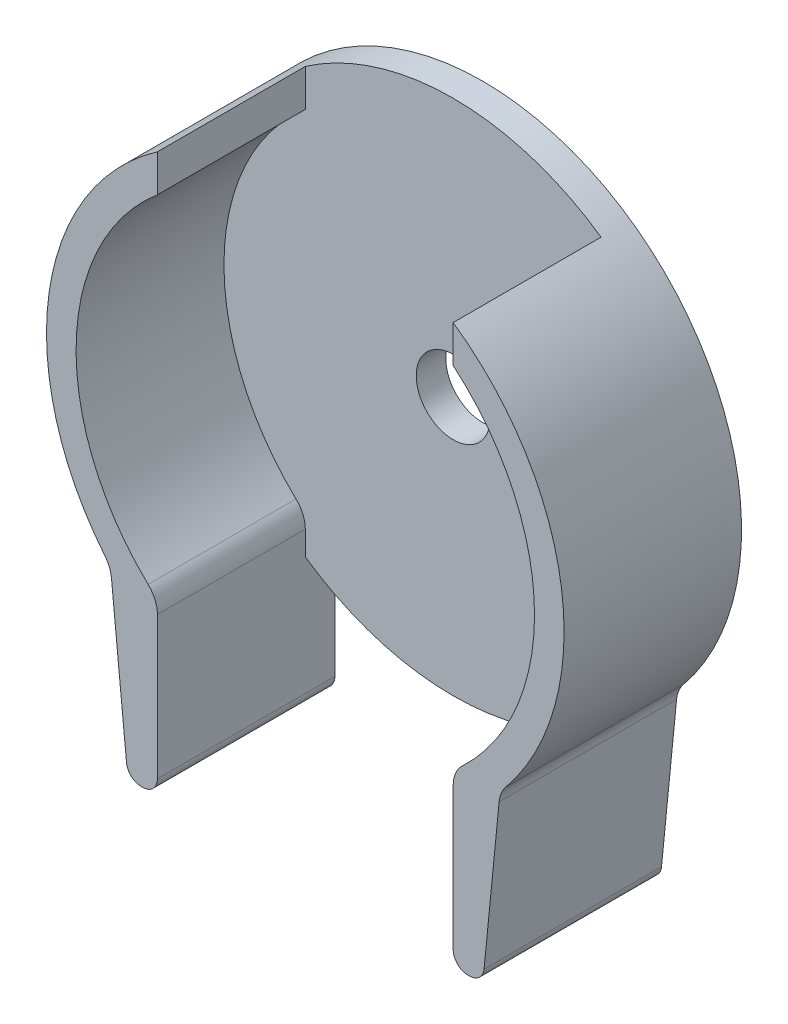
ISO-10303-21;
HEADER;
FILE_DESCRIPTION(('STEP AP214'),'2;1');
FILE_NAME('part.step','',(''),(''),'','','');
FILE_SCHEMA(('AUTOMOTIVE_DESIGN { 1 0 10303 214 1 1 1 1 }'));
ENDSEC;
DATA;
#1=APPLICATION_CONTEXT('core data for automotive mechanical design processes');
#2=APPLICATION_PROTOCOL_DEFINITION('international standard','automotive_design',2000,#1);
#3=PRODUCT_CONTEXT('',#1,'mechanical');
#4=PRODUCT('Part','Part','',(#3));
#5=PRODUCT_RELATED_PRODUCT_CATEGORY('part','',(#4));
#6=PRODUCT_DEFINITION_FORMATION('','',#4);
#7=PRODUCT_DEFINITION_CONTEXT('part definition',#1,'design');
#8=PRODUCT_DEFINITION('design','',#6,#7);
#9=PRODUCT_DEFINITION_SHAPE('','',#8);
#10=(LENGTH_UNIT() NAMED_UNIT(*) SI_UNIT(.MILLI.,.METRE.));
#11=(NAMED_UNIT(*) PLANE_ANGLE_UNIT() SI_UNIT($,.RADIAN.));
#12=(NAMED_UNIT(*) SI_UNIT($,.STERADIAN.) SOLID_ANGLE_UNIT());
#13=UNCERTAINTY_MEASURE_WITH_UNIT(LENGTH_MEASURE(1.E-05),#10,'distance_accuracy_value','');
#14=(GEOMETRIC_REPRESENTATION_CONTEXT(3) GLOBAL_UNCERTAINTY_ASSIGNED_CONTEXT((#13)) GLOBAL_UNIT_ASSIGNED_CONTEXT((#10,
#11,#12)) REPRESENTATION_CONTEXT('',''));
#15=CARTESIAN_POINT('',(0.,0.,0.));
#16=DIRECTION('',(0.,0.,1.));
#17=DIRECTION('',(1.,0.,0.));
#18=AXIS2_PLACEMENT_3D('',#15,#16,#17);
#19=CARTESIAN_POINT('',(0.,0.,12.));
#20=DIRECTION('',(0.,0.,-1.));
#21=DIRECTION('',(-1.,0.,0.));
#22=AXIS2_PLACEMENT_3D('',#19,#20,#21);
#23=CYLINDRICAL_SURFACE('',#22,17.5);
#24=CARTESIAN_POINT('',(0.,0.,2.));
#25=DIRECTION('',(0.,0.,-1.));
#26=DIRECTION('',(-1.,0.,0.));
#27=AXIS2_PLACEMENT_3D('',#24,#25,#26);
#28=CIRCLE('',#27,17.5);
#29=CARTESIAN_POINT('',(10.,-14.3614066163451,2.));
#30=VERTEX_POINT('',#29);
#31=CARTESIAN_POINT('',(-10.,-14.3614066163451,2.));
#32=VERTEX_POINT('',#31);
#33=EDGE_CURVE('E210',#30,#32,#28,.T.);
#34=ORIENTED_EDGE('',*,*,#33,.T.);
#35=DIRECTION('',(0.,0.,1.));
#36=VECTOR('',#35,1.);
#37=CARTESIAN_POINT('',(-10.,-14.3614066163451,0.));
#38=LINE('',#37,#36);
#39=CARTESIAN_POINT('',(-10.,-14.3614066163451,0.));
#40=VERTEX_POINT('',#39);
#41=EDGE_CURVE('E193',#40,#32,#38,.T.);
#42=ORIENTED_EDGE('',*,*,#41,.F.);
#43=CARTESIAN_POINT('',(0.,0.,0.));
#44=DIRECTION('',(0.,0.,1.));
#45=DIRECTION('',(1.,0.,0.));
#46=AXIS2_PLACEMENT_3D('',#43,#44,#45);
#47=CIRCLE('',#46,17.5);
#48=CARTESIAN_POINT('',(10.,-14.3614066163451,0.));
#49=VERTEX_POINT('',#48);
#50=EDGE_CURVE('E205',#40,#49,#47,.T.);
#51=ORIENTED_EDGE('',*,*,#50,.T.);
#52=DIRECTION('',(0.,0.,1.));
#53=VECTOR('',#52,1.);
#54=CARTESIAN_POINT('',(10.,-14.3614066163451,0.));
#55=LINE('',#54,#53);
#56=EDGE_CURVE('E322',#49,#30,#55,.T.);
#57=ORIENTED_EDGE('',*,*,#56,.T.);
#58=EDGE_LOOP('',(#34,#42,#51,#57));
#59=FACE_BOUND('',#58,.T.);
#60=ADVANCED_FACE('F45',(#59),#23,.T.);
#61=CARTESIAN_POINT('',(0.,0.,12.));
#62=DIRECTION('',(0.,0.,1.));
#63=DIRECTION('',(1.,0.,0.));
#64=AXIS2_PLACEMENT_3D('',#61,#62,#63);
#65=PLANE('',#64);
#66=DIRECTION('',(1.,0.,0.));
#67=VECTOR('',#66,1.);
#68=CARTESIAN_POINT('',(-10.,-23.3578165503246,12.));
#69=LINE('',#68,#67);
#70=CARTESIAN_POINT('',(-11.0939448005069,-23.3578165503246,12.));
#71=VERTEX_POINT('',#70);
#72=CARTESIAN_POINT('',(-11.,-23.3578165503246,12.));
#73=VERTEX_POINT('',#72);
#74=EDGE_CURVE('E299',#71,#73,#69,.T.);
#75=ORIENTED_EDGE('',*,*,#74,.T.);
#76=CARTESIAN_POINT('',(-11.,-22.3578165503246,12.));
#77=DIRECTION('',(0.,0.,1.));
#78=DIRECTION('',(1.,0.,0.));
#79=AXIS2_PLACEMENT_3D('',#76,#77,#78);
#80=CIRCLE('',#79,1.);
#81=CARTESIAN_POINT('',(-10.,-22.3578165503246,12.));
#82=VERTEX_POINT('',#81);
#83=EDGE_CURVE('E61',#73,#82,#80,.T.);
#84=ORIENTED_EDGE('',*,*,#83,.T.);
#85=DIRECTION('',(0.,-1.,0.));
#86=VECTOR('',#85,1.);
#87=CARTESIAN_POINT('',(-10.,0.,12.));
#88=LINE('',#87,#86);
#89=CARTESIAN_POINT('',(-10.,-12.737739202857,12.));
#90=VERTEX_POINT('',#89);
#91=EDGE_CURVE('E352',#90,#82,#88,.T.);
#92=ORIENTED_EDGE('',*,*,#91,.F.);
#93=CARTESIAN_POINT('',(-12.,-12.737739202857,12.));
#94=DIRECTION('',(0.,0.,1.));
#95=DIRECTION('',(1.,0.,0.));
#96=AXIS2_PLACEMENT_3D('',#93,#94,#95);
#97=CIRCLE('',#96,2.);
#98=CARTESIAN_POINT('',(-10.6285714285714,-11.2819975796733,12.));
#99=VERTEX_POINT('',#98);
#100=EDGE_CURVE('E241',#90,#99,#97,.T.);
#101=ORIENTED_EDGE('',*,*,#100,.T.);
#102=CARTESIAN_POINT('',(0.,0.,12.));
#103=DIRECTION('',(0.,0.,1.));
#104=DIRECTION('',(1.,0.,0.));
#105=AXIS2_PLACEMENT_3D('',#102,#103,#104);
#106=CIRCLE('',#105,15.5);
#107=CARTESIAN_POINT('',(-10.,11.842719282327,12.));
#108=VERTEX_POINT('',#107);
#109=EDGE_CURVE('E222',#108,#99,#106,.T.);
#110=ORIENTED_EDGE('',*,*,#109,.F.);
#111=CARTESIAN_POINT('',(-10.,14.3614066163451,12.));
#112=VERTEX_POINT('',#111);
#113=EDGE_CURVE('E355',#112,#108,#88,.T.);
#114=ORIENTED_EDGE('',*,*,#113,.F.);
#115=CARTESIAN_POINT('',(0.,0.,12.));
#116=DIRECTION('',(0.,0.,1.));
#117=DIRECTION('',(1.,0.,0.));
#118=AXIS2_PLACEMENT_3D('',#115,#116,#117);
#119=CIRCLE('',#118,17.5);
#120=CARTESIAN_POINT('',(-13.549863591173,-11.0748000731663,12.));
#121=VERTEX_POINT('',#120);
#122=EDGE_CURVE('E216',#112,#121,#119,.T.);
#123=ORIENTED_EDGE('',*,*,#122,.T.);
#124=CARTESIAN_POINT('',(-15.0984194301642,-12.3404915100996,12.));
#125=DIRECTION('',(0.,0.,1.));
#126=DIRECTION('',(1.,0.,0.));
#127=AXIS2_PLACEMENT_3D('',#124,#125,#126);
#128=CIRCLE('',#127,2.);
#129=CARTESIAN_POINT('',(-13.1081129344097,-12.1438190591629,12.));
#130=VERTEX_POINT('',#129);
#131=EDGE_CURVE('E261',#121,#130,#128,.F.);
#132=ORIENTED_EDGE('',*,*,#131,.T.);
#133=DIRECTION('',(0.0983362254683656,-0.995153247877248,0.));
#134=VECTOR('',#133,1.);
#135=CARTESIAN_POINT('',(-12.,-23.3578165503246,12.));
#136=LINE('',#135,#134);
#137=CARTESIAN_POINT('',(-12.0890980483841,-22.456152775793,12.));
#138=VERTEX_POINT('',#137);
#139=EDGE_CURVE('E301',#130,#138,#136,.T.);
#140=ORIENTED_EDGE('',*,*,#139,.T.);
#141=CARTESIAN_POINT('',(-11.0939448005069,-22.3578165503246,12.));
#142=DIRECTION('',(0.,0.,1.));
#143=DIRECTION('',(1.,0.,0.));
#144=AXIS2_PLACEMENT_3D('',#141,#142,#143);
#145=CIRCLE('',#144,1.);
#146=EDGE_CURVE('E60',#138,#71,#145,.T.);
#147=ORIENTED_EDGE('',*,*,#146,.T.);
#148=EDGE_LOOP('',(#75,#84,#92,#101,#110,#114,#123,#132,#140,#147));
#149=FACE_BOUND('',#148,.T.);
#150=ADVANCED_FACE('F296',(#149),#65,.T.);
#151=CARTESIAN_POINT('',(0.,0.,12.));
#152=DIRECTION('',(0.,0.,-1.));
#153=DIRECTION('',(-1.,0.,0.));
#154=AXIS2_PLACEMENT_3D('',#151,#152,#153);
#155=CYLINDRICAL_SURFACE('',#154,15.5);
#156=ORIENTED_EDGE('',*,*,#109,.T.);
#157=DIRECTION('',(0.,0.,-1.));
#158=VECTOR('',#157,1.);
#159=CARTESIAN_POINT('',(-10.6285714285714,-11.2819975796733,12.));
#160=LINE('',#159,#158);
#161=CARTESIAN_POINT('',(-10.6285714285714,-11.2819975796733,2.));
#162=VERTEX_POINT('',#161);
#163=EDGE_CURVE('E243',#99,#162,#160,.T.);
#164=ORIENTED_EDGE('',*,*,#163,.T.);
#165=CARTESIAN_POINT('',(0.,0.,2.));
#166=DIRECTION('',(0.,0.,1.));
#167=DIRECTION('',(1.,0.,0.));
#168=AXIS2_PLACEMENT_3D('',#165,#166,#167);
#169=CIRCLE('',#168,15.5);
#170=CARTESIAN_POINT('',(-10.,11.842719282327,2.));
#171=VERTEX_POINT('',#170);
#172=EDGE_CURVE('E365',#171,#162,#169,.T.);
#173=ORIENTED_EDGE('',*,*,#172,.F.);
#174=DIRECTION('',(0.,0.,-1.));
#175=VECTOR('',#174,1.);
#176=CARTESIAN_POINT('',(-10.,11.842719282327,12.));
#177=LINE('',#176,#175);
#178=EDGE_CURVE('E353',#108,#171,#177,.T.);
#179=ORIENTED_EDGE('',*,*,#178,.F.);
#180=EDGE_LOOP('',(#156,#164,#173,#179));
#181=FACE_BOUND('',#180,.T.);
#182=ADVANCED_FACE('F381',(#181),#155,.F.);
#183=CARTESIAN_POINT('',(13.549863591173,-11.0748000731663,12.));
#184=VERTEX_POINT('',#183);
#185=CARTESIAN_POINT('',(10.,14.3614066163451,12.));
#186=VERTEX_POINT('',#185);
#187=EDGE_CURVE('E217',#184,#186,#119,.T.);
#188=ORIENTED_EDGE('',*,*,#187,.F.);
#189=DIRECTION('',(0.,0.,-1.));
#190=VECTOR('',#189,1.);
#191=CARTESIAN_POINT('',(13.549863591173,-11.0748000731663,12.));
#192=LINE('',#191,#190);
#193=CARTESIAN_POINT('',(13.549863591173,-11.0748000731663,0.));
#194=VERTEX_POINT('',#193);
#195=EDGE_CURVE('E253',#184,#194,#192,.T.);
#196=ORIENTED_EDGE('',*,*,#195,.T.);
#197=CARTESIAN_POINT('',(-13.549863591173,-11.0748000731663,0.));
#198=VERTEX_POINT('',#197);
#199=EDGE_CURVE('E219',#194,#198,#47,.T.);
#200=ORIENTED_EDGE('',*,*,#199,.T.);
#201=DIRECTION('',(0.,0.,-1.));
#202=VECTOR('',#201,1.);
#203=CARTESIAN_POINT('',(-13.549863591173,-11.0748000731664,12.));
#204=LINE('',#203,#202);
#205=EDGE_CURVE('E255',#198,#121,#204,.F.);
#206=ORIENTED_EDGE('',*,*,#205,.T.);
#207=ORIENTED_EDGE('',*,*,#122,.F.);
#208=DIRECTION('',(0.,0.,-1.));
#209=VECTOR('',#208,1.);
#210=CARTESIAN_POINT('',(-10.,14.3614066163451,12.));
#211=LINE('',#210,#209);
#212=CARTESIAN_POINT('',(-10.,14.3614066163451,2.));
#213=VERTEX_POINT('',#212);
#214=EDGE_CURVE('E230',#112,#213,#211,.T.);
#215=ORIENTED_EDGE('',*,*,#214,.T.);
#216=CARTESIAN_POINT('',(10.,14.3614066163451,2.));
#217=VERTEX_POINT('',#216);
#218=EDGE_CURVE('E338',#213,#217,#28,.T.);
#219=ORIENTED_EDGE('',*,*,#218,.T.);
#220=DIRECTION('',(0.,0.,-1.));
#221=VECTOR('',#220,1.);
#222=CARTESIAN_POINT('',(10.,14.3614066163451,12.));
#223=LINE('',#222,#221);
#224=EDGE_CURVE('E350',#217,#186,#223,.F.);
#225=ORIENTED_EDGE('',*,*,#224,.T.);
#226=EDGE_LOOP('',(#188,#196,#200,#206,#207,#215,#219,#225));
#227=FACE_BOUND('',#226,.T.);
#228=ADVANCED_FACE('F392',(#227),#23,.T.);
#229=DIRECTION('',(0.,1.,0.));
#230=VECTOR('',#229,1.);
#231=CARTESIAN_POINT('',(10.,0.,12.));
#232=LINE('',#231,#230);
#233=CARTESIAN_POINT('',(10.,-22.3578165503246,12.));
#234=VERTEX_POINT('',#233);
#235=CARTESIAN_POINT('',(10.,-12.737739202857,12.));
#236=VERTEX_POINT('',#235);
#237=EDGE_CURVE('E346',#234,#236,#232,.T.);
#238=ORIENTED_EDGE('',*,*,#237,.F.);
#239=CARTESIAN_POINT('',(11.,-22.3578165503246,12.));
#240=DIRECTION('',(0.,0.,1.));
#241=DIRECTION('',(1.,0.,0.));
#242=AXIS2_PLACEMENT_3D('',#239,#240,#241);
#243=CIRCLE('',#242,1.);
#244=CARTESIAN_POINT('',(11.,-23.3578165503246,12.));
#245=VERTEX_POINT('',#244);
#246=EDGE_CURVE('E271',#234,#245,#243,.T.);
#247=ORIENTED_EDGE('',*,*,#246,.T.);
#248=DIRECTION('',(1.,0.,0.));
#249=VECTOR('',#248,1.);
#250=CARTESIAN_POINT('',(10.,-23.3578165503246,12.));
#251=LINE('',#250,#249);
#252=CARTESIAN_POINT('',(11.0939448005069,-23.3578165503246,12.));
#253=VERTEX_POINT('',#252);
#254=EDGE_CURVE('E316',#245,#253,#251,.T.);
#255=ORIENTED_EDGE('',*,*,#254,.T.);
#256=CARTESIAN_POINT('',(11.0939448005069,-22.3578165503246,12.));
#257=DIRECTION('',(0.,0.,1.));
#258=DIRECTION('',(1.,0.,0.));
#259=AXIS2_PLACEMENT_3D('',#256,#257,#258);
#260=CIRCLE('',#259,1.);
#261=CARTESIAN_POINT('',(12.0890980483841,-22.456152775793,12.));
#262=VERTEX_POINT('',#261);
#263=EDGE_CURVE('E272',#253,#262,#260,.T.);
#264=ORIENTED_EDGE('',*,*,#263,.T.);
#265=DIRECTION('',(0.0983362254683651,0.995153247877248,0.));
#266=VECTOR('',#265,1.);
#267=CARTESIAN_POINT('',(12.,-23.3578165503246,12.));
#268=LINE('',#267,#266);
#269=CARTESIAN_POINT('',(13.1081129344097,-12.1438190591629,12.));
#270=VERTEX_POINT('',#269);
#271=EDGE_CURVE('E321',#262,#270,#268,.T.);
#272=ORIENTED_EDGE('',*,*,#271,.T.);
#273=CARTESIAN_POINT('',(15.0984194301642,-12.3404915100996,12.));
#274=DIRECTION('',(0.,0.,1.));
#275=DIRECTION('',(1.,0.,0.));
#276=AXIS2_PLACEMENT_3D('',#273,#274,#275);
#277=CIRCLE('',#276,2.);
#278=EDGE_CURVE('E256',#270,#184,#277,.F.);
#279=ORIENTED_EDGE('',*,*,#278,.T.);
#280=ORIENTED_EDGE('',*,*,#187,.T.);
#281=CARTESIAN_POINT('',(10.,11.842719282327,12.));
#282=VERTEX_POINT('',#281);
#283=EDGE_CURVE('E343',#282,#186,#232,.T.);
#284=ORIENTED_EDGE('',*,*,#283,.F.);
#285=CARTESIAN_POINT('',(10.6285714285714,-11.2819975796733,12.));
#286=VERTEX_POINT('',#285);
#287=EDGE_CURVE('E361',#286,#282,#106,.T.);
#288=ORIENTED_EDGE('',*,*,#287,.F.);
#289=CARTESIAN_POINT('',(12.,-12.737739202857,12.));
#290=DIRECTION('',(0.,0.,1.));
#291=DIRECTION('',(1.,0.,0.));
#292=AXIS2_PLACEMENT_3D('',#289,#290,#291);
#293=CIRCLE('',#292,2.);
#294=EDGE_CURVE('E232',#286,#236,#293,.T.);
#295=ORIENTED_EDGE('',*,*,#294,.T.);
#296=EDGE_LOOP('',(#238,#247,#255,#264,#272,#279,#280,#284,#288,#295));
#297=FACE_BOUND('',#296,.T.);
#298=ADVANCED_FACE('F417',(#297),#65,.T.);
#299=CARTESIAN_POINT('',(0.,0.,0.));
#300=DIRECTION('',(0.,0.,1.));
#301=DIRECTION('',(1.,0.,0.));
#302=AXIS2_PLACEMENT_3D('',#299,#300,#301);
#303=PLANE('',#302);
#304=CARTESIAN_POINT('',(0.,0.,0.));
#305=DIRECTION('',(0.,0.,1.));
#306=DIRECTION('',(1.,0.,0.));
#307=AXIS2_PLACEMENT_3D('',#304,#305,#306);
#308=CIRCLE('',#307,2.5);
#309=CARTESIAN_POINT('',(2.5,0.,0.));
#310=VERTEX_POINT('',#309);
#311=EDGE_CURVE('E226',#310,#310,#308,.F.);
#312=ORIENTED_EDGE('',*,*,#311,.F.);
#313=EDGE_LOOP('',(#312));
#314=FACE_BOUND('',#313,.T.);
#315=DIRECTION('',(1.,0.,0.));
#316=VECTOR('',#315,1.);
#317=CARTESIAN_POINT('',(10.,-23.3578165503246,0.));
#318=LINE('',#317,#316);
#319=CARTESIAN_POINT('',(11.,-23.3578165503246,0.));
#320=VERTEX_POINT('',#319);
#321=CARTESIAN_POINT('',(11.0939448005069,-23.3578165503246,0.));
#322=VERTEX_POINT('',#321);
#323=EDGE_CURVE('E326',#320,#322,#318,.T.);
#324=ORIENTED_EDGE('',*,*,#323,.F.);
#325=CARTESIAN_POINT('',(11.,-22.3578165503246,0.));
#326=DIRECTION('',(0.,0.,1.));
#327=DIRECTION('',(1.,0.,0.));
#328=AXIS2_PLACEMENT_3D('',#325,#326,#327);
#329=CIRCLE('',#328,1.);
#330=CARTESIAN_POINT('',(10.,-22.3578165503246,0.));
#331=VERTEX_POINT('',#330);
#332=EDGE_CURVE('E286',#320,#331,#329,.F.);
#333=ORIENTED_EDGE('',*,*,#332,.T.);
#334=DIRECTION('',(0.,-1.,0.));
#335=VECTOR('',#334,1.);
#336=CARTESIAN_POINT('',(10.,-14.3614066163451,0.));
#337=LINE('',#336,#335);
#338=EDGE_CURVE('E213',#49,#331,#337,.T.);
#339=ORIENTED_EDGE('',*,*,#338,.F.);
#340=ORIENTED_EDGE('',*,*,#50,.F.);
#341=DIRECTION('',(0.,1.,0.));
#342=VECTOR('',#341,1.);
#343=CARTESIAN_POINT('',(-10.,-14.3614066163451,0.));
#344=LINE('',#343,#342);
#345=CARTESIAN_POINT('',(-10.,-22.3578165503246,0.));
#346=VERTEX_POINT('',#345);
#347=EDGE_CURVE('E192',#346,#40,#344,.T.);
#348=ORIENTED_EDGE('',*,*,#347,.F.);
#349=CARTESIAN_POINT('',(-11.,-22.3578165503246,0.));
#350=DIRECTION('',(0.,0.,1.));
#351=DIRECTION('',(1.,0.,0.));
#352=AXIS2_PLACEMENT_3D('',#349,#350,#351);
#353=CIRCLE('',#352,1.);
#354=CARTESIAN_POINT('',(-11.,-23.3578165503246,0.));
#355=VERTEX_POINT('',#354);
#356=EDGE_CURVE('E284',#346,#355,#353,.F.);
#357=ORIENTED_EDGE('',*,*,#356,.T.);
#358=DIRECTION('',(1.,0.,0.));
#359=VECTOR('',#358,1.);
#360=CARTESIAN_POINT('',(-10.,-23.3578165503246,0.));
#361=LINE('',#360,#359);
#362=CARTESIAN_POINT('',(-11.0939448005069,-23.3578165503246,0.));
#363=VERTEX_POINT('',#362);
#364=EDGE_CURVE('E201',#363,#355,#361,.T.);
#365=ORIENTED_EDGE('',*,*,#364,.F.);
#366=CARTESIAN_POINT('',(-11.0939448005069,-22.3578165503246,0.));
#367=DIRECTION('',(0.,0.,1.));
#368=DIRECTION('',(1.,0.,0.));
#369=AXIS2_PLACEMENT_3D('',#366,#367,#368);
#370=CIRCLE('',#369,1.);
#371=CARTESIAN_POINT('',(-12.0890980483841,-22.456152775793,0.));
#372=VERTEX_POINT('',#371);
#373=EDGE_CURVE('E278',#363,#372,#370,.F.);
#374=ORIENTED_EDGE('',*,*,#373,.T.);
#375=DIRECTION('',(0.0983362254683656,-0.995153247877248,0.));
#376=VECTOR('',#375,1.);
#377=CARTESIAN_POINT('',(-12.,-23.3578165503246,0.));
#378=LINE('',#377,#376);
#379=CARTESIAN_POINT('',(-13.1081129344097,-12.1438190591629,0.));
#380=VERTEX_POINT('',#379);
#381=EDGE_CURVE('E310',#380,#372,#378,.T.);
#382=ORIENTED_EDGE('',*,*,#381,.F.);
#383=CARTESIAN_POINT('',(-15.0984194301642,-12.3404915100996,0.));
#384=DIRECTION('',(0.,0.,1.));
#385=DIRECTION('',(1.,0.,0.));
#386=AXIS2_PLACEMENT_3D('',#383,#384,#385);
#387=CIRCLE('',#386,2.);
#388=EDGE_CURVE('E266',#380,#198,#387,.T.);
#389=ORIENTED_EDGE('',*,*,#388,.T.);
#390=ORIENTED_EDGE('',*,*,#199,.F.);
#391=CARTESIAN_POINT('',(15.0984194301642,-12.3404915100996,0.));
#392=DIRECTION('',(0.,0.,1.));
#393=DIRECTION('',(1.,0.,0.));
#394=AXIS2_PLACEMENT_3D('',#391,#392,#393);
#395=CIRCLE('',#394,2.);
#396=CARTESIAN_POINT('',(13.1081129344097,-12.1438190591629,0.));
#397=VERTEX_POINT('',#396);
#398=EDGE_CURVE('E262',#194,#397,#395,.T.);
#399=ORIENTED_EDGE('',*,*,#398,.T.);
#400=DIRECTION('',(0.0983362254683651,0.995153247877248,0.));
#401=VECTOR('',#400,1.);
#402=CARTESIAN_POINT('',(12.,-23.3578165503246,0.));
#403=LINE('',#402,#401);
#404=CARTESIAN_POINT('',(12.0890980483841,-22.456152775793,0.));
#405=VERTEX_POINT('',#404);
#406=EDGE_CURVE('E324',#405,#397,#403,.T.);
#407=ORIENTED_EDGE('',*,*,#406,.F.);
#408=CARTESIAN_POINT('',(11.0939448005069,-22.3578165503246,0.));
#409=DIRECTION('',(0.,0.,1.));
#410=DIRECTION('',(1.,0.,0.));
#411=AXIS2_PLACEMENT_3D('',#408,#409,#410);
#412=CIRCLE('',#411,1.);
#413=EDGE_CURVE('E281',#405,#322,#412,.F.);
#414=ORIENTED_EDGE('',*,*,#413,.T.);
#415=EDGE_LOOP('',(#324,#333,#339,#340,#348,#357,#365,#374,#382,#389,#390,#399,#407,#414));
#416=FACE_BOUND('',#415,.T.);
#417=ADVANCED_FACE('F214',(#314,#416),#303,.F.);
#418=CARTESIAN_POINT('',(10.6285714285714,-11.2819975796733,2.));
#419=VERTEX_POINT('',#418);
#420=CARTESIAN_POINT('',(10.,11.842719282327,2.));
#421=VERTEX_POINT('',#420);
#422=EDGE_CURVE('E363',#419,#421,#169,.T.);
#423=ORIENTED_EDGE('',*,*,#422,.F.);
#424=DIRECTION('',(0.,0.,-1.));
#425=VECTOR('',#424,1.);
#426=CARTESIAN_POINT('',(10.6285714285714,-11.2819975796733,12.));
#427=LINE('',#426,#425);
#428=EDGE_CURVE('E231',#419,#286,#427,.F.);
#429=ORIENTED_EDGE('',*,*,#428,.T.);
#430=ORIENTED_EDGE('',*,*,#287,.T.);
#431=DIRECTION('',(0.,0.,-1.));
#432=VECTOR('',#431,1.);
#433=CARTESIAN_POINT('',(10.,11.842719282327,12.));
#434=LINE('',#433,#432);
#435=EDGE_CURVE('E345',#421,#282,#434,.F.);
#436=ORIENTED_EDGE('',*,*,#435,.F.);
#437=EDGE_LOOP('',(#423,#429,#430,#436));
#438=FACE_BOUND('',#437,.T.);
#439=ADVANCED_FACE('F427',(#438),#155,.F.);
#440=CARTESIAN_POINT('',(0.,0.,2.));
#441=DIRECTION('',(0.,0.,1.));
#442=DIRECTION('',(1.,0.,0.));
#443=AXIS2_PLACEMENT_3D('',#440,#441,#442);
#444=PLANE('',#443);
#445=DIRECTION('',(0.,1.,0.));
#446=VECTOR('',#445,1.);
#447=CARTESIAN_POINT('',(10.,-17.5,2.));
#448=LINE('',#447,#446);
#449=CARTESIAN_POINT('',(10.,-12.737739202857,2.));
#450=VERTEX_POINT('',#449);
#451=EDGE_CURVE('E340',#30,#450,#448,.T.);
#452=ORIENTED_EDGE('',*,*,#451,.T.);
#453=CARTESIAN_POINT('',(12.,-12.737739202857,2.));
#454=DIRECTION('',(0.,0.,1.));
#455=DIRECTION('',(1.,0.,0.));
#456=AXIS2_PLACEMENT_3D('',#453,#454,#455);
#457=CIRCLE('',#456,2.);
#458=EDGE_CURVE('E244',#450,#419,#457,.F.);
#459=ORIENTED_EDGE('',*,*,#458,.T.);
#460=ORIENTED_EDGE('',*,*,#422,.T.);
#461=EDGE_CURVE('E209',#421,#217,#448,.T.);
#462=ORIENTED_EDGE('',*,*,#461,.T.);
#463=ORIENTED_EDGE('',*,*,#218,.F.);
#464=DIRECTION('',(0.,1.,0.));
#465=VECTOR('',#464,1.);
#466=CARTESIAN_POINT('',(-10.,-17.5,2.));
#467=LINE('',#466,#465);
#468=EDGE_CURVE('E334',#171,#213,#467,.T.);
#469=ORIENTED_EDGE('',*,*,#468,.F.);
#470=ORIENTED_EDGE('',*,*,#172,.T.);
#471=CARTESIAN_POINT('',(-12.,-12.737739202857,2.));
#472=DIRECTION('',(0.,0.,1.));
#473=DIRECTION('',(1.,0.,0.));
#474=AXIS2_PLACEMENT_3D('',#471,#472,#473);
#475=CIRCLE('',#474,2.);
#476=CARTESIAN_POINT('',(-10.,-12.737739202857,2.));
#477=VERTEX_POINT('',#476);
#478=EDGE_CURVE('E250',#162,#477,#475,.F.);
#479=ORIENTED_EDGE('',*,*,#478,.T.);
#480=EDGE_CURVE('E337',#32,#477,#467,.T.);
#481=ORIENTED_EDGE('',*,*,#480,.F.);
#482=ORIENTED_EDGE('',*,*,#33,.F.);
#483=EDGE_LOOP('',(#452,#459,#460,#462,#463,#469,#470,#479,#481,#482));
#484=FACE_BOUND('',#483,.T.);
#485=CARTESIAN_POINT('',(0.,0.,2.));
#486=DIRECTION('',(0.,0.,1.));
#487=DIRECTION('',(1.,0.,0.));
#488=AXIS2_PLACEMENT_3D('',#485,#486,#487);
#489=CIRCLE('',#488,2.5);
#490=CARTESIAN_POINT('',(2.5,0.,2.));
#491=VERTEX_POINT('',#490);
#492=EDGE_CURVE('E225',#491,#491,#489,.F.);
#493=ORIENTED_EDGE('',*,*,#492,.T.);
#494=EDGE_LOOP('',(#493));
#495=FACE_BOUND('',#494,.T.);
#496=ADVANCED_FACE('F372',(#484,#495),#444,.T.);
#497=CARTESIAN_POINT('',(0.,0.,12.));
#498=DIRECTION('',(0.,0.,-1.));
#499=DIRECTION('',(-1.,0.,0.));
#500=AXIS2_PLACEMENT_3D('',#497,#498,#499);
#501=CYLINDRICAL_SURFACE('',#500,2.5);
#502=ORIENTED_EDGE('',*,*,#492,.F.);
#503=EDGE_LOOP('',(#502));
#504=FACE_BOUND('',#503,.T.);
#505=ORIENTED_EDGE('',*,*,#311,.T.);
#506=EDGE_LOOP('',(#505));
#507=FACE_BOUND('',#506,.T.);
#508=ADVANCED_FACE('F438',(#504,#507),#501,.F.);
#509=CARTESIAN_POINT('',(10.,-17.5,2.));
#510=DIRECTION('',(1.,0.,0.));
#511=DIRECTION('',(0.,0.,-1.));
#512=AXIS2_PLACEMENT_3D('',#509,#510,#511);
#513=PLANE('',#512);
#514=ORIENTED_EDGE('',*,*,#461,.F.);
#515=ORIENTED_EDGE('',*,*,#435,.T.);
#516=ORIENTED_EDGE('',*,*,#283,.T.);
#517=ORIENTED_EDGE('',*,*,#224,.F.);
#518=EDGE_LOOP('',(#514,#515,#516,#517));
#519=FACE_BOUND('',#518,.T.);
#520=ADVANCED_FACE('F436',(#519),#513,.F.);
#521=CARTESIAN_POINT('',(-10.,-17.5,2.));
#522=DIRECTION('',(-1.,0.,0.));
#523=DIRECTION('',(0.,0.,1.));
#524=AXIS2_PLACEMENT_3D('',#521,#522,#523);
#525=PLANE('',#524);
#526=ORIENTED_EDGE('',*,*,#113,.T.);
#527=ORIENTED_EDGE('',*,*,#178,.T.);
#528=ORIENTED_EDGE('',*,*,#468,.T.);
#529=ORIENTED_EDGE('',*,*,#214,.F.);
#530=EDGE_LOOP('',(#526,#527,#528,#529));
#531=FACE_BOUND('',#530,.T.);
#532=ADVANCED_FACE('F387',(#531),#525,.F.);
#533=ORIENTED_EDGE('',*,*,#91,.T.);
#534=DIRECTION('',(0.,0.,1.));
#535=VECTOR('',#534,1.);
#536=CARTESIAN_POINT('',(-10.,-22.3578165503246,0.));
#537=LINE('',#536,#535);
#538=EDGE_CURVE('E49',#82,#346,#537,.F.);
#539=ORIENTED_EDGE('',*,*,#538,.T.);
#540=ORIENTED_EDGE('',*,*,#347,.T.);
#541=ORIENTED_EDGE('',*,*,#41,.T.);
#542=ORIENTED_EDGE('',*,*,#480,.T.);
#543=DIRECTION('',(0.,0.,1.));
#544=VECTOR('',#543,1.);
#545=CARTESIAN_POINT('',(-10.,-12.737739202857,12.));
#546=LINE('',#545,#544);
#547=EDGE_CURVE('E238',#477,#90,#546,.T.);
#548=ORIENTED_EDGE('',*,*,#547,.T.);
#549=EDGE_LOOP('',(#533,#539,#540,#541,#542,#548));
#550=FACE_BOUND('',#549,.T.);
#551=ADVANCED_FACE('F194',(#550),#525,.F.);
#552=ORIENTED_EDGE('',*,*,#338,.T.);
#553=DIRECTION('',(0.,0.,1.));
#554=VECTOR('',#553,1.);
#555=CARTESIAN_POINT('',(10.,-22.3578165503246,12.));
#556=LINE('',#555,#554);
#557=EDGE_CURVE('E269',#331,#234,#556,.T.);
#558=ORIENTED_EDGE('',*,*,#557,.T.);
#559=ORIENTED_EDGE('',*,*,#237,.T.);
#560=DIRECTION('',(0.,0.,1.));
#561=VECTOR('',#560,1.);
#562=CARTESIAN_POINT('',(10.,-12.737739202857,2.));
#563=LINE('',#562,#561);
#564=EDGE_CURVE('E229',#236,#450,#563,.F.);
#565=ORIENTED_EDGE('',*,*,#564,.T.);
#566=ORIENTED_EDGE('',*,*,#451,.F.);
#567=ORIENTED_EDGE('',*,*,#56,.F.);
#568=EDGE_LOOP('',(#552,#558,#559,#565,#566,#567));
#569=FACE_BOUND('',#568,.T.);
#570=ADVANCED_FACE('F421',(#569),#513,.F.);
#571=CARTESIAN_POINT('',(12.,-23.3578165503246,0.));
#572=DIRECTION('',(0.995153247877248,-0.0983362254683651,0.));
#573=DIRECTION('',(0.0983362254683651,0.995153247877248,0.));
#574=AXIS2_PLACEMENT_3D('',#571,#572,#573);
#575=PLANE('',#574);
#576=ORIENTED_EDGE('',*,*,#271,.F.);
#577=DIRECTION('',(0.,0.,1.));
#578=VECTOR('',#577,1.);
#579=CARTESIAN_POINT('',(12.0890980483841,-22.456152775793,0.));
#580=LINE('',#579,#578);
#581=EDGE_CURVE('E289',#262,#405,#580,.F.);
#582=ORIENTED_EDGE('',*,*,#581,.T.);
#583=ORIENTED_EDGE('',*,*,#406,.T.);
#584=DIRECTION('',(0.,0.,-1.));
#585=VECTOR('',#584,1.);
#586=CARTESIAN_POINT('',(13.1081129344097,-12.1438190591629,0.));
#587=LINE('',#586,#585);
#588=EDGE_CURVE('E248',#397,#270,#587,.F.);
#589=ORIENTED_EDGE('',*,*,#588,.T.);
#590=EDGE_LOOP('',(#576,#582,#583,#589));
#591=FACE_BOUND('',#590,.T.);
#592=ADVANCED_FACE('F403',(#591),#575,.T.);
#593=CARTESIAN_POINT('',(10.,-23.3578165503246,0.));
#594=DIRECTION('',(0.,-1.,0.));
#595=DIRECTION('',(0.,0.,-1.));
#596=AXIS2_PLACEMENT_3D('',#593,#594,#595);
#597=PLANE('',#596);
#598=ORIENTED_EDGE('',*,*,#254,.F.);
#599=DIRECTION('',(0.,0.,1.));
#600=VECTOR('',#599,1.);
#601=CARTESIAN_POINT('',(11.,-23.3578165503246,0.));
#602=LINE('',#601,#600);
#603=EDGE_CURVE('E279',#245,#320,#602,.F.);
#604=ORIENTED_EDGE('',*,*,#603,.T.);
#605=ORIENTED_EDGE('',*,*,#323,.T.);
#606=DIRECTION('',(0.,0.,1.));
#607=VECTOR('',#606,1.);
#608=CARTESIAN_POINT('',(11.0939448005069,-23.3578165503246,0.));
#609=LINE('',#608,#607);
#610=EDGE_CURVE('E273',#322,#253,#609,.T.);
#611=ORIENTED_EDGE('',*,*,#610,.T.);
#612=EDGE_LOOP('',(#598,#604,#605,#611));
#613=FACE_BOUND('',#612,.T.);
#614=ADVANCED_FACE('F415',(#613),#597,.T.);
#615=CARTESIAN_POINT('',(-10.,-23.3578165503246,0.));
#616=DIRECTION('',(0.,-1.,0.));
#617=DIRECTION('',(0.,0.,-1.));
#618=AXIS2_PLACEMENT_3D('',#615,#616,#617);
#619=PLANE('',#618);
#620=ORIENTED_EDGE('',*,*,#364,.T.);
#621=DIRECTION('',(0.,0.,1.));
#622=VECTOR('',#621,1.);
#623=CARTESIAN_POINT('',(-11.,-23.3578165503246,12.));
#624=LINE('',#623,#622);
#625=EDGE_CURVE('E292',#355,#73,#624,.T.);
#626=ORIENTED_EDGE('',*,*,#625,.T.);
#627=ORIENTED_EDGE('',*,*,#74,.F.);
#628=DIRECTION('',(0.,0.,1.));
#629=VECTOR('',#628,1.);
#630=CARTESIAN_POINT('',(-11.0939448005069,-23.3578165503246,0.));
#631=LINE('',#630,#629);
#632=EDGE_CURVE('E290',#71,#363,#631,.F.);
#633=ORIENTED_EDGE('',*,*,#632,.T.);
#634=EDGE_LOOP('',(#620,#626,#627,#633));
#635=FACE_BOUND('',#634,.T.);
#636=ADVANCED_FACE('F302',(#635),#619,.T.);
#637=CARTESIAN_POINT('',(-12.,-23.3578165503246,0.));
#638=DIRECTION('',(-0.995153247877248,-0.0983362254683656,0.));
#639=DIRECTION('',(0.0983362254683656,-0.995153247877248,0.));
#640=AXIS2_PLACEMENT_3D('',#637,#638,#639);
#641=PLANE('',#640);
#642=ORIENTED_EDGE('',*,*,#381,.T.);
#643=DIRECTION('',(0.,0.,1.));
#644=VECTOR('',#643,1.);
#645=CARTESIAN_POINT('',(-12.0890980483841,-22.456152775793,0.));
#646=LINE('',#645,#644);
#647=EDGE_CURVE('E11',#372,#138,#646,.T.);
#648=ORIENTED_EDGE('',*,*,#647,.T.);
#649=ORIENTED_EDGE('',*,*,#139,.F.);
#650=DIRECTION('',(0.,0.,-1.));
#651=VECTOR('',#650,1.);
#652=CARTESIAN_POINT('',(-13.1081129344097,-12.1438190591629,0.));
#653=LINE('',#652,#651);
#654=EDGE_CURVE('E260',#130,#380,#653,.T.);
#655=ORIENTED_EDGE('',*,*,#654,.T.);
#656=EDGE_LOOP('',(#642,#648,#649,#655));
#657=FACE_BOUND('',#656,.T.);
#658=ADVANCED_FACE('F313',(#657),#641,.T.);
#659=CARTESIAN_POINT('',(12.,-12.737739202857,12.));
#660=DIRECTION('',(0.,0.,-1.));
#661=DIRECTION('',(-1.,0.,0.));
#662=AXIS2_PLACEMENT_3D('',#659,#660,#661);
#663=CYLINDRICAL_SURFACE('',#662,2.);
#664=ORIENTED_EDGE('',*,*,#294,.F.);
#665=ORIENTED_EDGE('',*,*,#428,.F.);
#666=ORIENTED_EDGE('',*,*,#458,.F.);
#667=ORIENTED_EDGE('',*,*,#564,.F.);
#668=EDGE_LOOP('',(#664,#665,#666,#667));
#669=FACE_BOUND('',#668,.T.);
#670=ADVANCED_FACE('F435',(#669),#663,.T.);
#671=CARTESIAN_POINT('',(-12.,-12.737739202857,12.));
#672=DIRECTION('',(0.,0.,-1.));
#673=DIRECTION('',(-1.,0.,0.));
#674=AXIS2_PLACEMENT_3D('',#671,#672,#673);
#675=CYLINDRICAL_SURFACE('',#674,2.);
#676=ORIENTED_EDGE('',*,*,#478,.F.);
#677=ORIENTED_EDGE('',*,*,#163,.F.);
#678=ORIENTED_EDGE('',*,*,#100,.F.);
#679=ORIENTED_EDGE('',*,*,#547,.F.);
#680=EDGE_LOOP('',(#676,#677,#678,#679));
#681=FACE_BOUND('',#680,.T.);
#682=ADVANCED_FACE('F382',(#681),#675,.T.);
#683=CARTESIAN_POINT('',(15.0984194301642,-12.3404915100996,12.));
#684=DIRECTION('',(0.,0.,-1.));
#685=DIRECTION('',(-1.,0.,0.));
#686=AXIS2_PLACEMENT_3D('',#683,#684,#685);
#687=CYLINDRICAL_SURFACE('',#686,2.);
#688=ORIENTED_EDGE('',*,*,#398,.F.);
#689=ORIENTED_EDGE('',*,*,#195,.F.);
#690=ORIENTED_EDGE('',*,*,#278,.F.);
#691=ORIENTED_EDGE('',*,*,#588,.F.);
#692=EDGE_LOOP('',(#688,#689,#690,#691));
#693=FACE_BOUND('',#692,.T.);
#694=ADVANCED_FACE('F402',(#693),#687,.F.);
#695=CARTESIAN_POINT('',(-15.0984194301642,-12.3404915100996,12.));
#696=DIRECTION('',(0.,0.,-1.));
#697=DIRECTION('',(-1.,0.,0.));
#698=AXIS2_PLACEMENT_3D('',#695,#696,#697);
#699=CYLINDRICAL_SURFACE('',#698,2.);
#700=ORIENTED_EDGE('',*,*,#388,.F.);
#701=ORIENTED_EDGE('',*,*,#654,.F.);
#702=ORIENTED_EDGE('',*,*,#131,.F.);
#703=ORIENTED_EDGE('',*,*,#205,.F.);
#704=EDGE_LOOP('',(#700,#701,#702,#703));
#705=FACE_BOUND('',#704,.T.);
#706=ADVANCED_FACE('F393',(#705),#699,.F.);
#707=CARTESIAN_POINT('',(11.,-22.3578165503246,2.));
#708=DIRECTION('',(0.,0.,-1.));
#709=DIRECTION('',(-1.,0.,0.));
#710=AXIS2_PLACEMENT_3D('',#707,#708,#709);
#711=CYLINDRICAL_SURFACE('',#710,1.);
#712=ORIENTED_EDGE('',*,*,#332,.F.);
#713=ORIENTED_EDGE('',*,*,#603,.F.);
#714=ORIENTED_EDGE('',*,*,#246,.F.);
#715=ORIENTED_EDGE('',*,*,#557,.F.);
#716=EDGE_LOOP('',(#712,#713,#714,#715));
#717=FACE_BOUND('',#716,.T.);
#718=ADVANCED_FACE('F423',(#717),#711,.T.);
#719=CARTESIAN_POINT('',(11.0939448005069,-22.3578165503246,0.));
#720=DIRECTION('',(0.,0.,1.));
#721=DIRECTION('',(1.,0.,0.));
#722=AXIS2_PLACEMENT_3D('',#719,#720,#721);
#723=CYLINDRICAL_SURFACE('',#722,1.);
#724=ORIENTED_EDGE('',*,*,#413,.F.);
#725=ORIENTED_EDGE('',*,*,#581,.F.);
#726=ORIENTED_EDGE('',*,*,#263,.F.);
#727=ORIENTED_EDGE('',*,*,#610,.F.);
#728=EDGE_LOOP('',(#724,#725,#726,#727));
#729=FACE_BOUND('',#728,.T.);
#730=ADVANCED_FACE('F408',(#729),#723,.T.);
#731=CARTESIAN_POINT('',(-11.,-22.3578165503246,0.));
#732=DIRECTION('',(0.,0.,-1.));
#733=DIRECTION('',(-1.,0.,0.));
#734=AXIS2_PLACEMENT_3D('',#731,#732,#733);
#735=CYLINDRICAL_SURFACE('',#734,1.);
#736=ORIENTED_EDGE('',*,*,#356,.F.);
#737=ORIENTED_EDGE('',*,*,#538,.F.);
#738=ORIENTED_EDGE('',*,*,#83,.F.);
#739=ORIENTED_EDGE('',*,*,#625,.F.);
#740=EDGE_LOOP('',(#736,#737,#738,#739));
#741=FACE_BOUND('',#740,.T.);
#742=ADVANCED_FACE('F534',(#741),#735,.T.);
#743=CARTESIAN_POINT('',(-11.0939448005069,-22.3578165503246,0.));
#744=DIRECTION('',(0.,0.,1.));
#745=DIRECTION('',(1.,0.,0.));
#746=AXIS2_PLACEMENT_3D('',#743,#744,#745);
#747=CYLINDRICAL_SURFACE('',#746,1.);
#748=ORIENTED_EDGE('',*,*,#373,.F.);
#749=ORIENTED_EDGE('',*,*,#632,.F.);
#750=ORIENTED_EDGE('',*,*,#146,.F.);
#751=ORIENTED_EDGE('',*,*,#647,.F.);
#752=EDGE_LOOP('',(#748,#749,#750,#751));
#753=FACE_BOUND('',#752,.T.);
#754=ADVANCED_FACE('F42',(#753),#747,.T.);
#755=CLOSED_SHELL('',(#60,#150,#182,#228,#298,#417,#439,#496,#508,#520,#532,#551,#570,#592,#614,
#636,#658,#670,#682,#694,#706,#718,#730,#742,#754));
#756=MANIFOLD_SOLID_BREP('B2',#755);
#757=ADVANCED_BREP_SHAPE_REPRESENTATION('',(#18,#756),#14);
#758=SHAPE_DEFINITION_REPRESENTATION(#9,#757);
ENDSEC;
END-ISO-10303-21;
